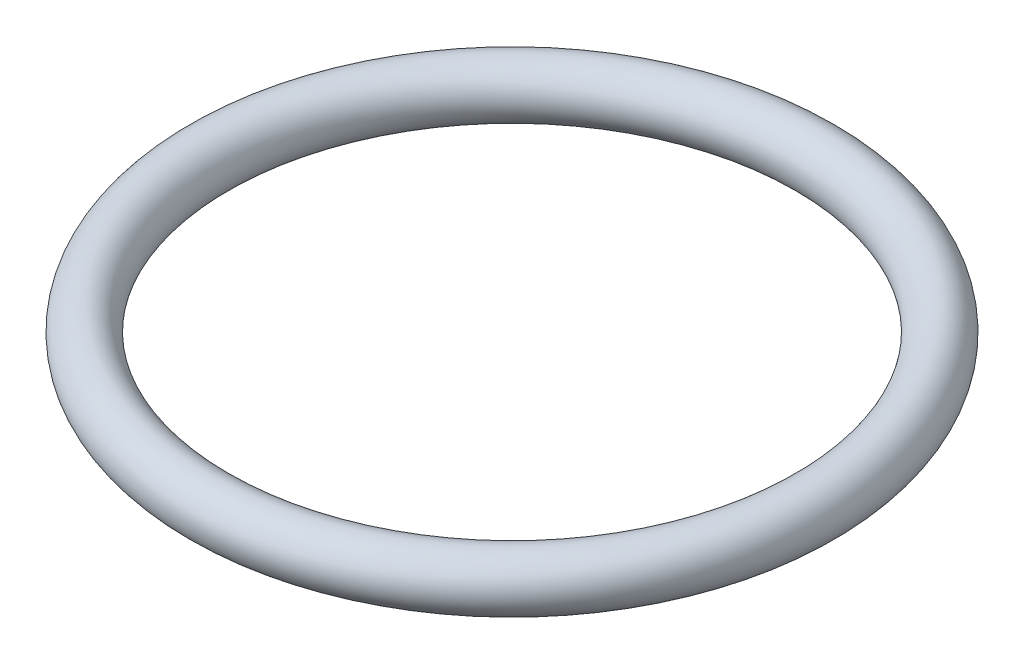
ISO-10303-21;
HEADER;
FILE_DESCRIPTION(('STEP AP214'),'2;1');
FILE_NAME('part.step','',(''),(''),'','','');
FILE_SCHEMA(('AUTOMOTIVE_DESIGN { 1 0 10303 214 1 1 1 1 }'));
ENDSEC;
DATA;
#1=APPLICATION_CONTEXT('core data for automotive mechanical design processes');
#2=APPLICATION_PROTOCOL_DEFINITION('international standard','automotive_design',2000,#1);
#3=PRODUCT_CONTEXT('',#1,'mechanical');
#4=PRODUCT('Part','Part','',(#3));
#5=PRODUCT_RELATED_PRODUCT_CATEGORY('part','',(#4));
#6=PRODUCT_DEFINITION_FORMATION('','',#4);
#7=PRODUCT_DEFINITION_CONTEXT('part definition',#1,'design');
#8=PRODUCT_DEFINITION('design','',#6,#7);
#9=PRODUCT_DEFINITION_SHAPE('','',#8);
#10=(LENGTH_UNIT() NAMED_UNIT(*) SI_UNIT(.MILLI.,.METRE.));
#11=(NAMED_UNIT(*) PLANE_ANGLE_UNIT() SI_UNIT($,.RADIAN.));
#12=(NAMED_UNIT(*) SI_UNIT($,.STERADIAN.) SOLID_ANGLE_UNIT());
#13=UNCERTAINTY_MEASURE_WITH_UNIT(LENGTH_MEASURE(1.E-05),#10,'distance_accuracy_value','');
#14=(GEOMETRIC_REPRESENTATION_CONTEXT(3) GLOBAL_UNCERTAINTY_ASSIGNED_CONTEXT((#13)) GLOBAL_UNIT_ASSIGNED_CONTEXT((#10,
#11,#12)) REPRESENTATION_CONTEXT('',''));
#15=CARTESIAN_POINT('',(0.,0.,0.));
#16=DIRECTION('',(0.,0.,1.));
#17=DIRECTION('',(1.,0.,0.));
#18=AXIS2_PLACEMENT_3D('',#15,#16,#17);
#19=CARTESIAN_POINT('',(0.,0.,0.));
#20=DIRECTION('',(0.,-1.,0.));
#21=DIRECTION('',(0.,0.,-1.));
#22=AXIS2_PLACEMENT_3D('',#19,#20,#21);
#23=TOROIDAL_SURFACE('',#22,13.97,1.25);
#24=CARTESIAN_POINT('',(0.,0.,-15.22));
#25=VERTEX_POINT('',#24);
#26=VERTEX_LOOP('',#25);
#27=FACE_BOUND('',#26,.T.);
#28=ADVANCED_FACE('F34',(#27),#23,.T.);
#29=CLOSED_SHELL('',(#28));
#30=MANIFOLD_SOLID_BREP('B2',#29);
#31=ADVANCED_BREP_SHAPE_REPRESENTATION('',(#18,#30),#14);
#32=SHAPE_DEFINITION_REPRESENTATION(#9,#31);
ENDSEC;
END-ISO-10303-21;
